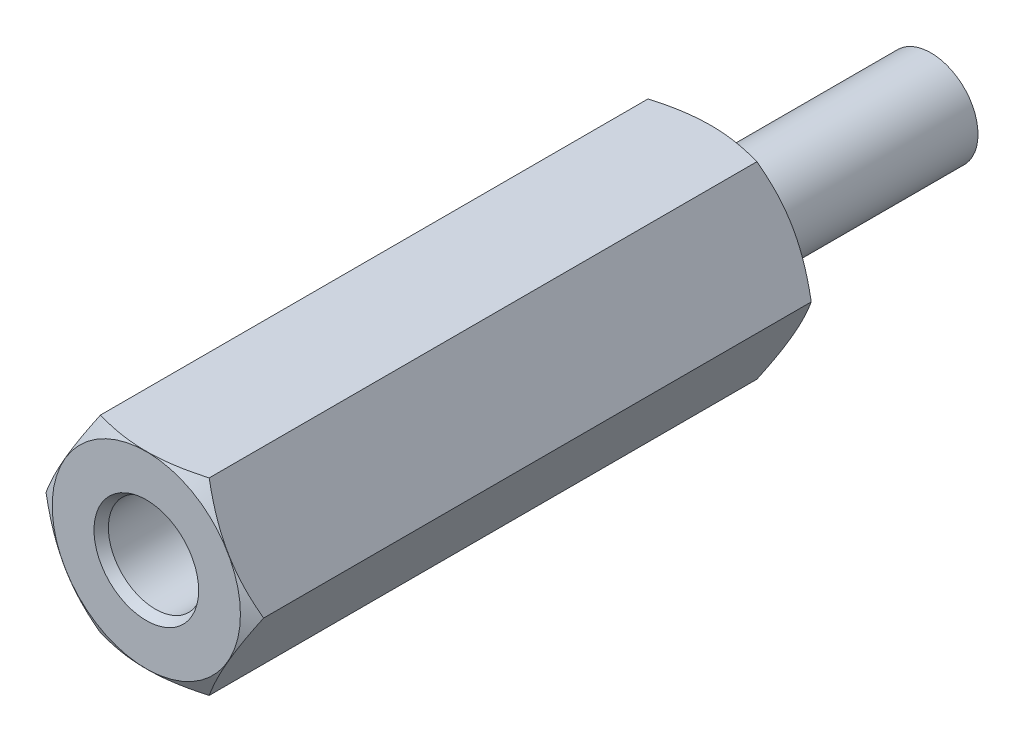
ISO-10303-21;
HEADER;
FILE_DESCRIPTION(('STEP AP214'),'2;1');
FILE_NAME('part.step','',(''),(''),'','','');
FILE_SCHEMA(('AUTOMOTIVE_DESIGN { 1 0 10303 214 1 1 1 1 }'));
ENDSEC;
DATA;
#1=APPLICATION_CONTEXT('core data for automotive mechanical design processes');
#2=APPLICATION_PROTOCOL_DEFINITION('international standard','automotive_design',2000,#1);
#3=PRODUCT_CONTEXT('',#1,'mechanical');
#4=PRODUCT('Part','Part','',(#3));
#5=PRODUCT_RELATED_PRODUCT_CATEGORY('part','',(#4));
#6=PRODUCT_DEFINITION_FORMATION('','',#4);
#7=PRODUCT_DEFINITION_CONTEXT('part definition',#1,'design');
#8=PRODUCT_DEFINITION('design','',#6,#7);
#9=PRODUCT_DEFINITION_SHAPE('','',#8);
#10=(LENGTH_UNIT() NAMED_UNIT(*) SI_UNIT(.MILLI.,.METRE.));
#11=(NAMED_UNIT(*) PLANE_ANGLE_UNIT() SI_UNIT($,.RADIAN.));
#12=(NAMED_UNIT(*) SI_UNIT($,.STERADIAN.) SOLID_ANGLE_UNIT());
#13=UNCERTAINTY_MEASURE_WITH_UNIT(LENGTH_MEASURE(1.E-05),#10,'distance_accuracy_value','');
#14=(GEOMETRIC_REPRESENTATION_CONTEXT(3) GLOBAL_UNCERTAINTY_ASSIGNED_CONTEXT((#13)) GLOBAL_UNIT_ASSIGNED_CONTEXT((#10,
#11,#12)) REPRESENTATION_CONTEXT('',''));
#15=CARTESIAN_POINT('',(0.,0.,0.));
#16=DIRECTION('',(0.,0.,1.));
#17=DIRECTION('',(1.,0.,0.));
#18=AXIS2_PLACEMENT_3D('',#15,#16,#17);
#19=CARTESIAN_POINT('',(0.,0.,9.));
#20=DIRECTION('',(0.,0.,1.));
#21=DIRECTION('',(1.,0.,0.));
#22=AXIS2_PLACEMENT_3D('',#19,#20,#21);
#23=CONICAL_SURFACE('',#22,1.25,1.047197551197);
#24=CARTESIAN_POINT('',(0.,0.,8.27831216351364));
#25=VERTEX_POINT('',#24);
#26=VERTEX_LOOP('',#25);
#27=FACE_BOUND('',#26,.T.);
#28=CARTESIAN_POINT('',(0.,0.,9.));
#29=DIRECTION('',(0.,0.,1.));
#30=DIRECTION('',(1.,0.,0.));
#31=AXIS2_PLACEMENT_3D('',#28,#29,#30);
#32=CIRCLE('',#31,1.25);
#33=CARTESIAN_POINT('',(1.25,0.,9.));
#34=VERTEX_POINT('',#33);
#35=EDGE_CURVE('E11',#34,#34,#32,.T.);
#36=ORIENTED_EDGE('',*,*,#35,.T.);
#37=EDGE_LOOP('',(#36));
#38=FACE_BOUND('',#37,.T.);
#39=ADVANCED_FACE('F16',(#27,#38),#23,.F.);
#40=CARTESIAN_POINT('',(0.,0.,-6.));
#41=DIRECTION('',(0.,0.,1.));
#42=DIRECTION('',(1.,0.,0.));
#43=AXIS2_PLACEMENT_3D('',#40,#41,#42);
#44=PLANE('',#43);
#45=CARTESIAN_POINT('',(0.,0.,-6.));
#46=DIRECTION('',(0.,0.,1.));
#47=DIRECTION('',(1.,0.,0.));
#48=AXIS2_PLACEMENT_3D('',#45,#46,#47);
#49=CIRCLE('',#48,0.98);
#50=CARTESIAN_POINT('',(0.98,0.,-6.));
#51=VERTEX_POINT('',#50);
#52=EDGE_CURVE('E196',#51,#51,#49,.T.);
#53=ORIENTED_EDGE('',*,*,#52,.F.);
#54=EDGE_LOOP('',(#53));
#55=FACE_BOUND('',#54,.T.);
#56=ADVANCED_FACE('F18',(#55),#44,.F.);
#57=CARTESIAN_POINT('',(0.,0.,14.75751288694));
#58=DIRECTION('',(0.,0.,-1.));
#59=DIRECTION('',(1.,0.,0.));
#60=AXIS2_PLACEMENT_3D('',#57,#58,#59);
#61=CYLINDRICAL_SURFACE('',#60,1.25);
#62=CARTESIAN_POINT('',(0.,0.,14.75751288694));
#63=DIRECTION('',(0.,0.,1.));
#64=DIRECTION('',(1.,0.,0.));
#65=AXIS2_PLACEMENT_3D('',#62,#63,#64);
#66=CIRCLE('',#65,1.25);
#67=CARTESIAN_POINT('',(1.25,0.,14.75751288694));
#68=VERTEX_POINT('',#67);
#69=EDGE_CURVE('E193',#68,#68,#66,.T.);
#70=ORIENTED_EDGE('',*,*,#69,.T.);
#71=DIRECTION('',(0.,0.,-1.));
#72=VECTOR('',#71,1.);
#73=CARTESIAN_POINT('',(1.25,0.,14.75751288694));
#74=LINE('',#73,#72);
#75=EDGE_CURVE('E20',#68,#34,#74,.T.);
#76=ORIENTED_EDGE('',*,*,#75,.T.);
#77=ORIENTED_EDGE('',*,*,#35,.F.);
#78=ORIENTED_EDGE('',*,*,#75,.F.);
#79=EDGE_LOOP('',(#70,#76,#77,#78));
#80=FACE_BOUND('',#79,.T.);
#81=ADVANCED_FACE('F338',(#80),#61,.F.);
#82=CARTESIAN_POINT('',(0.,0.,-6.));
#83=DIRECTION('',(0.,0.,1.));
#84=DIRECTION('',(1.,0.,0.));
#85=AXIS2_PLACEMENT_3D('',#82,#83,#84);
#86=CONICAL_SURFACE('',#85,0.98,1.047197551197);
#87=ORIENTED_EDGE('',*,*,#52,.T.);
#88=DIRECTION('',(0.866025403784329,0.,0.50000000000019));
#89=VECTOR('',#88,1.);
#90=CARTESIAN_POINT('',(0.98,0.,-6.));
#91=LINE('',#90,#89);
#92=CARTESIAN_POINT('',(1.25,0.,-5.844115427319));
#93=VERTEX_POINT('',#92);
#94=EDGE_CURVE('E197',#51,#93,#91,.T.);
#95=ORIENTED_EDGE('',*,*,#94,.T.);
#96=CARTESIAN_POINT('',(0.,0.,-5.844115427319));
#97=DIRECTION('',(0.,0.,1.));
#98=DIRECTION('',(1.,0.,0.));
#99=AXIS2_PLACEMENT_3D('',#96,#97,#98);
#100=CIRCLE('',#99,1.25);
#101=EDGE_CURVE('E177',#93,#93,#100,.T.);
#102=ORIENTED_EDGE('',*,*,#101,.F.);
#103=ORIENTED_EDGE('',*,*,#94,.F.);
#104=EDGE_LOOP('',(#87,#95,#102,#103));
#105=FACE_BOUND('',#104,.T.);
#106=ADVANCED_FACE('F335',(#105),#86,.T.);
#107=CARTESIAN_POINT('',(0.,0.,15.));
#108=DIRECTION('',(0.,0.,1.));
#109=DIRECTION('',(1.,0.,0.));
#110=AXIS2_PLACEMENT_3D('',#107,#108,#109);
#111=CONICAL_SURFACE('',#110,1.39,0.523598775598);
#112=CARTESIAN_POINT('',(0.,0.,15.));
#113=DIRECTION('',(0.,0.,1.));
#114=DIRECTION('',(1.,0.,0.));
#115=AXIS2_PLACEMENT_3D('',#112,#113,#114);
#116=CIRCLE('',#115,1.39);
#117=CARTESIAN_POINT('',(1.39,0.,15.));
#118=VERTEX_POINT('',#117);
#119=EDGE_CURVE('E170',#118,#118,#116,.T.);
#120=ORIENTED_EDGE('',*,*,#119,.T.);
#121=DIRECTION('',(-0.50000000000019,0.,-0.866025403784329));
#122=VECTOR('',#121,1.);
#123=CARTESIAN_POINT('',(1.39,0.,15.));
#124=LINE('',#123,#122);
#125=EDGE_CURVE('E192',#118,#68,#124,.T.);
#126=ORIENTED_EDGE('',*,*,#125,.T.);
#127=ORIENTED_EDGE('',*,*,#69,.F.);
#128=ORIENTED_EDGE('',*,*,#125,.F.);
#129=EDGE_LOOP('',(#120,#126,#127,#128));
#130=FACE_BOUND('',#129,.T.);
#131=ADVANCED_FACE('F337',(#130),#111,.F.);
#132=CARTESIAN_POINT('',(0.,0.,-5.844115427319));
#133=DIRECTION('',(0.,0.,1.));
#134=DIRECTION('',(1.,0.,0.));
#135=AXIS2_PLACEMENT_3D('',#132,#133,#134);
#136=CYLINDRICAL_SURFACE('',#135,1.25);
#137=ORIENTED_EDGE('',*,*,#101,.T.);
#138=DIRECTION('',(0.,0.,1.));
#139=VECTOR('',#138,1.);
#140=CARTESIAN_POINT('',(1.25,0.,-5.844115427319));
#141=LINE('',#140,#139);
#142=CARTESIAN_POINT('',(1.25,0.,0.));
#143=VERTEX_POINT('',#142);
#144=EDGE_CURVE('E189',#93,#143,#141,.T.);
#145=ORIENTED_EDGE('',*,*,#144,.T.);
#146=CARTESIAN_POINT('',(0.,0.,0.));
#147=DIRECTION('',(0.,0.,1.));
#148=DIRECTION('',(1.,0.,0.));
#149=AXIS2_PLACEMENT_3D('',#146,#147,#148);
#150=CIRCLE('',#149,1.25);
#151=EDGE_CURVE('E178',#143,#143,#150,.T.);
#152=ORIENTED_EDGE('',*,*,#151,.F.);
#153=ORIENTED_EDGE('',*,*,#144,.F.);
#154=EDGE_LOOP('',(#137,#145,#152,#153));
#155=FACE_BOUND('',#154,.T.);
#156=ADVANCED_FACE('F334',(#155),#136,.T.);
#157=CARTESIAN_POINT('',(0.,0.,15.));
#158=DIRECTION('',(0.,0.,1.));
#159=DIRECTION('',(1.,0.,0.));
#160=AXIS2_PLACEMENT_3D('',#157,#158,#159);
#161=PLANE('',#160);
#162=ORIENTED_EDGE('',*,*,#119,.F.);
#163=EDGE_LOOP('',(#162));
#164=FACE_BOUND('',#163,.T.);
#165=CARTESIAN_POINT('',(0.,0.,15.));
#166=DIRECTION('',(0.,0.,1.));
#167=DIRECTION('',(1.,0.,0.));
#168=AXIS2_PLACEMENT_3D('',#165,#166,#167);
#169=CIRCLE('',#168,2.5);
#170=CARTESIAN_POINT('',(2.5,0.,15.));
#171=VERTEX_POINT('',#170);
#172=EDGE_CURVE('E146',#171,#171,#169,.T.);
#173=ORIENTED_EDGE('',*,*,#172,.T.);
#174=EDGE_LOOP('',(#173));
#175=FACE_BOUND('',#174,.T.);
#176=ADVANCED_FACE('F330',(#164,#175),#161,.T.);
#177=CARTESIAN_POINT('',(0.,0.,0.));
#178=DIRECTION('',(0.,0.,1.));
#179=DIRECTION('',(1.,0.,0.));
#180=AXIS2_PLACEMENT_3D('',#177,#178,#179);
#181=PLANE('',#180);
#182=CARTESIAN_POINT('',(0.,0.,0.));
#183=DIRECTION('',(0.,0.,1.));
#184=DIRECTION('',(1.,0.,0.));
#185=AXIS2_PLACEMENT_3D('',#182,#183,#184);
#186=CIRCLE('',#185,2.5);
#187=CARTESIAN_POINT('',(2.5,0.,0.));
#188=VERTEX_POINT('',#187);
#189=EDGE_CURVE('E284',#188,#188,#186,.T.);
#190=ORIENTED_EDGE('',*,*,#189,.F.);
#191=EDGE_LOOP('',(#190));
#192=FACE_BOUND('',#191,.T.);
#193=ORIENTED_EDGE('',*,*,#151,.T.);
#194=EDGE_LOOP('',(#193));
#195=FACE_BOUND('',#194,.T.);
#196=ADVANCED_FACE('F327',(#192,#195),#181,.F.);
#197=CARTESIAN_POINT('',(-1.445,-2.502813416937,-10.));
#198=DIRECTION('',(0.,1.,0.));
#199=DIRECTION('',(1.,0.,0.));
#200=AXIS2_PLACEMENT_3D('',#197,#198,#199);
#201=PLANE('',#200);
#202=DIRECTION('',(0.,0.,1.));
#203=VECTOR('',#202,1.);
#204=CARTESIAN_POINT('',(1.445,-2.502813416937,-10.));
#205=LINE('',#204,#203);
#206=CARTESIAN_POINT('',(1.445,-2.502813416937,0.225166604984));
#207=VERTEX_POINT('',#206);
#208=CARTESIAN_POINT('',(1.445,-2.502813416937,14.774833395016));
#209=VERTEX_POINT('',#208);
#210=EDGE_CURVE('E129',#207,#209,#205,.T.);
#211=ORIENTED_EDGE('',*,*,#210,.T.);
#212=CARTESIAN_POINT('',(1.44500000000008,-2.502813416937,14.7748333950159));
#213=CARTESIAN_POINT('',(0.,-2.50281341693701,15.1919689645055));
#214=CARTESIAN_POINT('',(-1.44499999999997,-2.502813416937,14.774833395016));
#215=(BOUNDED_CURVE() B_SPLINE_CURVE(2,(#212,#213,#214),.UNSPECIFIED.,.F.,
.F.) B_SPLINE_CURVE_WITH_KNOTS((3,3),(0.,1.),
.UNSPECIFIED.) CURVE() GEOMETRIC_REPRESENTATION_ITEM() RATIONAL_B_SPLINE_CURVE((1.,
1.15470053837926,1.)) REPRESENTATION_ITEM(''));
#216=CARTESIAN_POINT('',(-1.445,-2.502813416937,14.774833395016));
#217=VERTEX_POINT('',#216);
#218=EDGE_CURVE('E138',#209,#217,#215,.T.);
#219=ORIENTED_EDGE('',*,*,#218,.T.);
#220=DIRECTION('',(0.,0.,1.));
#221=VECTOR('',#220,1.);
#222=CARTESIAN_POINT('',(-1.445,-2.502813416937,-10.));
#223=LINE('',#222,#221);
#224=CARTESIAN_POINT('',(-1.445,-2.502813416937,0.225166604984));
#225=VERTEX_POINT('',#224);
#226=EDGE_CURVE('E128',#225,#217,#223,.T.);
#227=ORIENTED_EDGE('',*,*,#226,.F.);
#228=CARTESIAN_POINT('',(-1.44500000000008,-2.502813416937,0.225166604984046));
#229=CARTESIAN_POINT('',(0.,-2.50281341693701,-0.191968964505495));
#230=CARTESIAN_POINT('',(1.44499999999997,-2.502813416937,0.225166604984016));
#231=(BOUNDED_CURVE() B_SPLINE_CURVE(2,(#228,#229,#230),.UNSPECIFIED.,.F.,
.F.) B_SPLINE_CURVE_WITH_KNOTS((3,3),(0.,1.),
.UNSPECIFIED.) CURVE() GEOMETRIC_REPRESENTATION_ITEM() RATIONAL_B_SPLINE_CURVE((1.,
1.15470053837926,1.)) REPRESENTATION_ITEM(''));
#232=EDGE_CURVE('E220',#225,#207,#231,.T.);
#233=ORIENTED_EDGE('',*,*,#232,.T.);
#234=EDGE_LOOP('',(#211,#219,#227,#233));
#235=FACE_BOUND('',#234,.T.);
#236=ADVANCED_FACE('F322',(#235),#201,.F.);
#237=CARTESIAN_POINT('',(-2.89,0.,-10.));
#238=DIRECTION('',(0.866025403784329,0.50000000000019,0.));
#239=DIRECTION('',(0.,0.,-1.));
#240=AXIS2_PLACEMENT_3D('',#237,#238,#239);
#241=PLANE('',#240);
#242=ORIENTED_EDGE('',*,*,#226,.T.);
#243=CARTESIAN_POINT('',(-1.44499999999986,-2.50281341693713,14.7748333950159));
#244=CARTESIAN_POINT('',(-2.16750000000007,-1.25140670846888,15.1919689645056));
#245=CARTESIAN_POINT('',(-2.89000000000033,-5.42232925226927E-13,14.7748333950158));
#246=(BOUNDED_CURVE() B_SPLINE_CURVE(2,(#243,#244,#245),.UNSPECIFIED.,.F.,
.F.) B_SPLINE_CURVE_WITH_KNOTS((3,3),(0.,1.),
.UNSPECIFIED.) CURVE() GEOMETRIC_REPRESENTATION_ITEM() RATIONAL_B_SPLINE_CURVE((1.,
1.15470053837934,1.)) REPRESENTATION_ITEM(''));
#247=CARTESIAN_POINT('',(-2.89,0.,14.774833395016));
#248=VERTEX_POINT('',#247);
#249=EDGE_CURVE('E132',#217,#248,#246,.T.);
#250=ORIENTED_EDGE('',*,*,#249,.T.);
#251=DIRECTION('',(0.,0.,1.));
#252=VECTOR('',#251,1.);
#253=CARTESIAN_POINT('',(-2.89,0.,-10.));
#254=LINE('',#253,#252);
#255=CARTESIAN_POINT('',(-2.89,0.,0.225166604984));
#256=VERTEX_POINT('',#255);
#257=EDGE_CURVE('E116',#256,#248,#254,.T.);
#258=ORIENTED_EDGE('',*,*,#257,.F.);
#259=CARTESIAN_POINT('',(-2.89000000000094,5.09592368302947E-13,0.225166604984566));
#260=CARTESIAN_POINT('',(-2.16750000000034,-1.2514067084684,-0.191968964505698));
#261=CARTESIAN_POINT('',(-1.44499999999998,-2.50281341693691,0.225166604984036));
#262=(BOUNDED_CURVE() B_SPLINE_CURVE(2,(#259,#260,#261),.UNSPECIFIED.,.F.,
.F.) B_SPLINE_CURVE_WITH_KNOTS((3,3),(0.,1.),
.UNSPECIFIED.) CURVE() GEOMETRIC_REPRESENTATION_ITEM() RATIONAL_B_SPLINE_CURVE((1.,
1.15470053837945,1.)) REPRESENTATION_ITEM(''));
#263=EDGE_CURVE('E216',#256,#225,#262,.T.);
#264=ORIENTED_EDGE('',*,*,#263,.T.);
#265=EDGE_LOOP('',(#242,#250,#258,#264));
#266=FACE_BOUND('',#265,.T.);
#267=ADVANCED_FACE('F133',(#266),#241,.F.);
#268=CARTESIAN_POINT('',(-1.445,2.502813416937,-10.));
#269=DIRECTION('',(0.866025403784329,-0.50000000000019,0.));
#270=DIRECTION('',(0.,0.,-1.));
#271=AXIS2_PLACEMENT_3D('',#268,#269,#270);
#272=PLANE('',#271);
#273=ORIENTED_EDGE('',*,*,#257,.T.);
#274=CARTESIAN_POINT('',(-2.89000000000094,-5.06705788438921E-13,14.7748333950154));
#275=CARTESIAN_POINT('',(-2.16750000000035,1.2514067084684,15.1919689645057));
#276=CARTESIAN_POINT('',(-1.44499999999998,2.50281341693692,14.774833395016));
#277=(BOUNDED_CURVE() B_SPLINE_CURVE(2,(#274,#275,#276),.UNSPECIFIED.,.F.,
.F.) B_SPLINE_CURVE_WITH_KNOTS((3,3),(0.,1.),
.UNSPECIFIED.) CURVE() GEOMETRIC_REPRESENTATION_ITEM() RATIONAL_B_SPLINE_CURVE((1.,
1.15470053837944,1.)) REPRESENTATION_ITEM(''));
#278=CARTESIAN_POINT('',(-1.445,2.502813416937,14.774833395016));
#279=VERTEX_POINT('',#278);
#280=EDGE_CURVE('E120',#248,#279,#277,.T.);
#281=ORIENTED_EDGE('',*,*,#280,.T.);
#282=DIRECTION('',(0.,0.,1.));
#283=VECTOR('',#282,1.);
#284=CARTESIAN_POINT('',(-1.445,2.502813416937,-10.));
#285=LINE('',#284,#283);
#286=CARTESIAN_POINT('',(-1.445,2.502813416937,0.225166604984));
#287=VERTEX_POINT('',#286);
#288=EDGE_CURVE('E238',#287,#279,#285,.T.);
#289=ORIENTED_EDGE('',*,*,#288,.F.);
#290=CARTESIAN_POINT('',(-1.44499999999986,2.50281341693713,0.225166604984106));
#291=CARTESIAN_POINT('',(-2.16750000000007,1.25140670846888,-0.191968964505593));
#292=CARTESIAN_POINT('',(-2.89000000000033,5.42899059041702E-13,0.225166604984216));
#293=(BOUNDED_CURVE() B_SPLINE_CURVE(2,(#290,#291,#292),.UNSPECIFIED.,.F.,
.F.) B_SPLINE_CURVE_WITH_KNOTS((3,3),(0.,1.),
.UNSPECIFIED.) CURVE() GEOMETRIC_REPRESENTATION_ITEM() RATIONAL_B_SPLINE_CURVE((1.,
1.15470053837935,1.)) REPRESENTATION_ITEM(''));
#294=EDGE_CURVE('E123',#287,#256,#293,.T.);
#295=ORIENTED_EDGE('',*,*,#294,.T.);
#296=EDGE_LOOP('',(#273,#281,#289,#295));
#297=FACE_BOUND('',#296,.T.);
#298=ADVANCED_FACE('F118',(#297),#272,.F.);
#299=CARTESIAN_POINT('',(1.445,-2.502813416937,-10.));
#300=DIRECTION('',(-0.866025403784329,0.50000000000019,0.));
#301=DIRECTION('',(0.,0.,1.));
#302=AXIS2_PLACEMENT_3D('',#299,#300,#301);
#303=PLANE('',#302);
#304=DIRECTION('',(0.,0.,1.));
#305=VECTOR('',#304,1.);
#306=CARTESIAN_POINT('',(2.89,0.,0.225166604984));
#307=LINE('',#306,#305);
#308=CARTESIAN_POINT('',(2.89,0.,0.225166604984));
#309=VERTEX_POINT('',#308);
#310=CARTESIAN_POINT('',(2.89,0.,14.774833395016));
#311=VERTEX_POINT('',#310);
#312=EDGE_CURVE('E269',#309,#311,#307,.T.);
#313=ORIENTED_EDGE('',*,*,#312,.T.);
#314=CARTESIAN_POINT('',(2.89000000000101,6.33049168641264E-13,14.7748333950154));
#315=CARTESIAN_POINT('',(2.16750000000037,-1.25140670846836,15.1919689645057));
#316=CARTESIAN_POINT('',(1.44499999999998,-2.50281341693692,14.774833395016));
#317=(BOUNDED_CURVE() B_SPLINE_CURVE(2,(#314,#315,#316),.UNSPECIFIED.,.F.,
.F.) B_SPLINE_CURVE_WITH_KNOTS((3,3),(0.,1.),
.UNSPECIFIED.) CURVE() GEOMETRIC_REPRESENTATION_ITEM() RATIONAL_B_SPLINE_CURVE((1.,
1.15470053837946,1.)) REPRESENTATION_ITEM(''));
#318=EDGE_CURVE('E237',#311,#209,#317,.T.);
#319=ORIENTED_EDGE('',*,*,#318,.T.);
#320=ORIENTED_EDGE('',*,*,#210,.F.);
#321=CARTESIAN_POINT('',(1.44499999999986,-2.50281341693713,0.225166604984106));
#322=CARTESIAN_POINT('',(2.16750000000006,-1.25140670846889,-0.191968964505588));
#323=CARTESIAN_POINT('',(2.89000000000031,-5.83089132533132E-13,0.225166604984202));
#324=(BOUNDED_CURVE() B_SPLINE_CURVE(2,(#321,#322,#323),.UNSPECIFIED.,.F.,
.F.) B_SPLINE_CURVE_WITH_KNOTS((3,3),(0.,1.),
.UNSPECIFIED.) CURVE() GEOMETRIC_REPRESENTATION_ITEM() RATIONAL_B_SPLINE_CURVE((1.,
1.15470053837935,1.)) REPRESENTATION_ITEM(''));
#325=EDGE_CURVE('E212',#207,#309,#324,.T.);
#326=ORIENTED_EDGE('',*,*,#325,.T.);
#327=EDGE_LOOP('',(#313,#319,#320,#326));
#328=FACE_BOUND('',#327,.T.);
#329=ADVANCED_FACE('F323',(#328),#303,.F.);
#330=CARTESIAN_POINT('',(0.,0.,14.774833395016));
#331=DIRECTION('',(0.,0.,-1.));
#332=DIRECTION('',(1.,0.,0.));
#333=AXIS2_PLACEMENT_3D('',#330,#331,#332);
#334=CONICAL_SURFACE('',#333,2.89,1.047197551197);
#335=ORIENTED_EDGE('',*,*,#318,.F.);
#336=DIRECTION('',(-0.866025403784329,0.,0.50000000000019));
#337=VECTOR('',#336,1.);
#338=CARTESIAN_POINT('',(2.89,0.,14.774833395016));
#339=LINE('',#338,#337);
#340=EDGE_CURVE('E151',#311,#171,#339,.T.);
#341=ORIENTED_EDGE('',*,*,#340,.T.);
#342=ORIENTED_EDGE('',*,*,#172,.F.);
#343=ORIENTED_EDGE('',*,*,#340,.F.);
#344=CARTESIAN_POINT('',(1.44499999999986,2.50281341693713,14.7748333950159));
#345=CARTESIAN_POINT('',(2.16750000000006,1.25140670846889,15.1919689645056));
#346=CARTESIAN_POINT('',(2.89000000000031,5.84199355557757E-13,14.7748333950158));
#347=(BOUNDED_CURVE() B_SPLINE_CURVE(2,(#344,#345,#346),.UNSPECIFIED.,.F.,
.F.) B_SPLINE_CURVE_WITH_KNOTS((3,3),(0.,1.),
.UNSPECIFIED.) CURVE() GEOMETRIC_REPRESENTATION_ITEM() RATIONAL_B_SPLINE_CURVE((1.,
1.15470053837934,1.)) REPRESENTATION_ITEM(''));
#348=CARTESIAN_POINT('',(1.445,2.502813416937,14.774833395016));
#349=VERTEX_POINT('',#348);
#350=EDGE_CURVE('E264',#349,#311,#347,.T.);
#351=ORIENTED_EDGE('',*,*,#350,.F.);
#352=CARTESIAN_POINT('',(-1.44500000000008,2.502813416937,14.7748333950159));
#353=CARTESIAN_POINT('',(0.,2.50281341693701,15.1919689645055));
#354=CARTESIAN_POINT('',(1.44499999999997,2.502813416937,14.774833395016));
#355=(BOUNDED_CURVE() B_SPLINE_CURVE(2,(#352,#353,#354),.UNSPECIFIED.,.F.,
.F.) B_SPLINE_CURVE_WITH_KNOTS((3,3),(0.,1.),
.UNSPECIFIED.) CURVE() GEOMETRIC_REPRESENTATION_ITEM() RATIONAL_B_SPLINE_CURVE((1.,
1.15470053837926,1.)) REPRESENTATION_ITEM(''));
#356=EDGE_CURVE('E143',#279,#349,#355,.T.);
#357=ORIENTED_EDGE('',*,*,#356,.F.);
#358=ORIENTED_EDGE('',*,*,#280,.F.);
#359=ORIENTED_EDGE('',*,*,#249,.F.);
#360=ORIENTED_EDGE('',*,*,#218,.F.);
#361=EDGE_LOOP('',(#335,#341,#342,#343,#351,#357,#358,#359,#360));
#362=FACE_BOUND('',#361,.T.);
#363=ADVANCED_FACE('F141',(#362),#334,.T.);
#364=CARTESIAN_POINT('',(1.445,2.502813416937,-10.));
#365=DIRECTION('',(0.,-1.,0.));
#366=DIRECTION('',(-1.,0.,0.));
#367=AXIS2_PLACEMENT_3D('',#364,#365,#366);
#368=PLANE('',#367);
#369=ORIENTED_EDGE('',*,*,#288,.T.);
#370=ORIENTED_EDGE('',*,*,#356,.T.);
#371=DIRECTION('',(0.,0.,1.));
#372=VECTOR('',#371,1.);
#373=CARTESIAN_POINT('',(1.445,2.502813416937,-10.));
#374=LINE('',#373,#372);
#375=CARTESIAN_POINT('',(1.445,2.502813416937,0.225166604984));
#376=VERTEX_POINT('',#375);
#377=EDGE_CURVE('E270',#376,#349,#374,.T.);
#378=ORIENTED_EDGE('',*,*,#377,.F.);
#379=CARTESIAN_POINT('',(1.44500000000008,2.502813416937,0.225166604984046));
#380=CARTESIAN_POINT('',(0.,2.50281341693701,-0.191968964505495));
#381=CARTESIAN_POINT('',(-1.44499999999997,2.502813416937,0.225166604984016));
#382=(BOUNDED_CURVE() B_SPLINE_CURVE(2,(#379,#380,#381),.UNSPECIFIED.,.F.,
.F.) B_SPLINE_CURVE_WITH_KNOTS((3,3),(0.,1.),
.UNSPECIFIED.) CURVE() GEOMETRIC_REPRESENTATION_ITEM() RATIONAL_B_SPLINE_CURVE((1.,
1.15470053837926,1.)) REPRESENTATION_ITEM(''));
#383=EDGE_CURVE('E229',#376,#287,#382,.T.);
#384=ORIENTED_EDGE('',*,*,#383,.T.);
#385=EDGE_LOOP('',(#369,#370,#378,#384));
#386=FACE_BOUND('',#385,.T.);
#387=ADVANCED_FACE('F315',(#386),#368,.F.);
#388=CARTESIAN_POINT('',(0.,0.,0.));
#389=DIRECTION('',(0.,0.,1.));
#390=DIRECTION('',(1.,0.,0.));
#391=AXIS2_PLACEMENT_3D('',#388,#389,#390);
#392=CONICAL_SURFACE('',#391,2.5,1.047197551197);
#393=DIRECTION('',(0.866025403784329,0.,0.50000000000019));
#394=VECTOR('',#393,1.);
#395=CARTESIAN_POINT('',(2.5,0.,0.));
#396=LINE('',#395,#394);
#397=EDGE_CURVE('E290',#188,#309,#396,.T.);
#398=ORIENTED_EDGE('',*,*,#397,.F.);
#399=ORIENTED_EDGE('',*,*,#189,.T.);
#400=ORIENTED_EDGE('',*,*,#397,.T.);
#401=ORIENTED_EDGE('',*,*,#325,.F.);
#402=ORIENTED_EDGE('',*,*,#232,.F.);
#403=ORIENTED_EDGE('',*,*,#263,.F.);
#404=ORIENTED_EDGE('',*,*,#294,.F.);
#405=ORIENTED_EDGE('',*,*,#383,.F.);
#406=CARTESIAN_POINT('',(2.89000000000101,-6.28830321147689E-13,0.225166604984606));
#407=CARTESIAN_POINT('',(2.16750000000037,1.25140670846836,-0.191968964505713));
#408=CARTESIAN_POINT('',(1.44499999999998,2.50281341693691,0.225166604984036));
#409=(BOUNDED_CURVE() B_SPLINE_CURVE(2,(#406,#407,#408),.UNSPECIFIED.,.F.,
.F.) B_SPLINE_CURVE_WITH_KNOTS((3,3),(0.,1.),
.UNSPECIFIED.) CURVE() GEOMETRIC_REPRESENTATION_ITEM() RATIONAL_B_SPLINE_CURVE((1.,
1.15470053837946,1.)) REPRESENTATION_ITEM(''));
#410=EDGE_CURVE('E276',#309,#376,#409,.T.);
#411=ORIENTED_EDGE('',*,*,#410,.F.);
#412=EDGE_LOOP('',(#398,#399,#400,#401,#402,#403,#404,#405,#411));
#413=FACE_BOUND('',#412,.T.);
#414=ADVANCED_FACE('F318',(#413),#392,.T.);
#415=CARTESIAN_POINT('',(2.89,0.,-10.));
#416=DIRECTION('',(-0.866025403784329,-0.50000000000019,0.));
#417=DIRECTION('',(-0.50000000000019,0.866025403784329,0.));
#418=AXIS2_PLACEMENT_3D('',#415,#416,#417);
#419=PLANE('',#418);
#420=ORIENTED_EDGE('',*,*,#377,.T.);
#421=ORIENTED_EDGE('',*,*,#350,.T.);
#422=ORIENTED_EDGE('',*,*,#312,.F.);
#423=ORIENTED_EDGE('',*,*,#410,.T.);
#424=EDGE_LOOP('',(#420,#421,#422,#423));
#425=FACE_BOUND('',#424,.T.);
#426=ADVANCED_FACE('F274',(#425),#419,.F.);
#427=CLOSED_SHELL('',(#39,#56,#81,#106,#131,#156,#176,#196,#236,#267,#298,#329,#363,#387,#414,#426));
#428=MANIFOLD_SOLID_BREP('B1',#427);
#429=ADVANCED_BREP_SHAPE_REPRESENTATION('',(#18,#428),#14);
#430=SHAPE_DEFINITION_REPRESENTATION(#9,#429);
ENDSEC;
END-ISO-10303-21;
